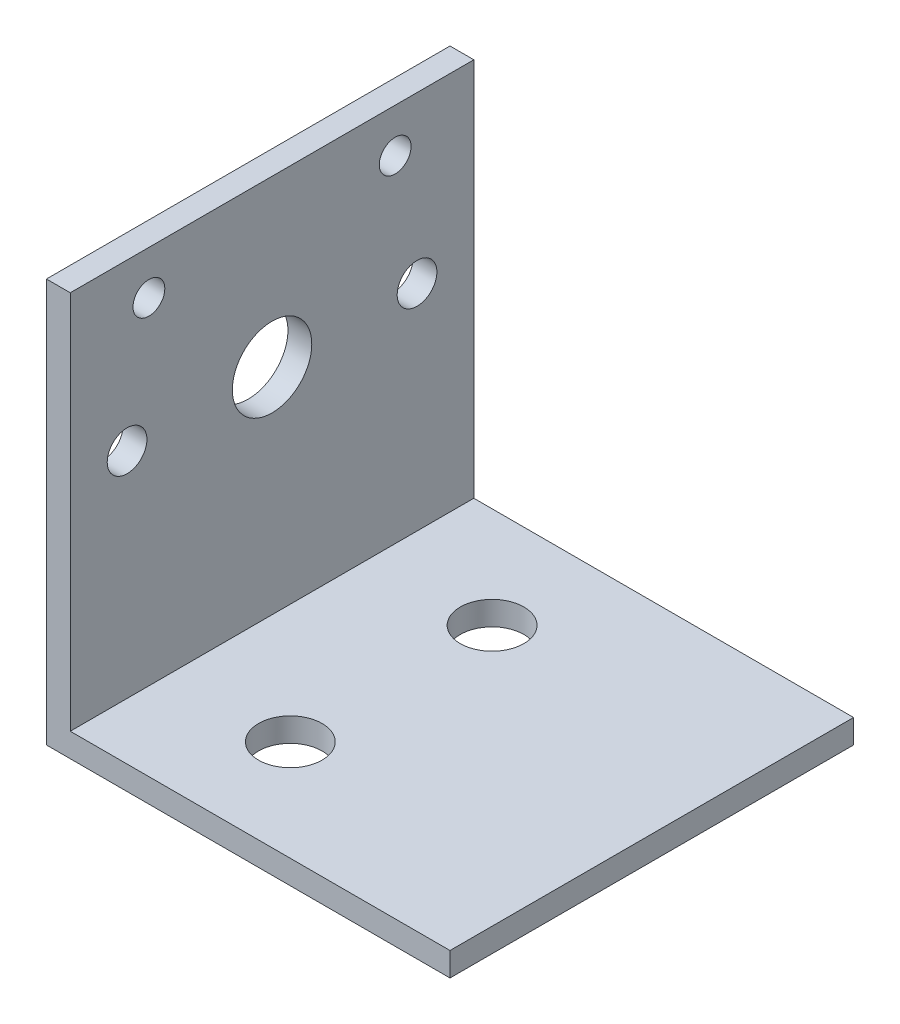
ISO-10303-21;
HEADER;
FILE_DESCRIPTION(('STEP AP214'),'2;1');
FILE_NAME('part.step','',(''),(''),'','','');
FILE_SCHEMA(('AUTOMOTIVE_DESIGN { 1 0 10303 214 1 1 1 1 }'));
ENDSEC;
DATA;
#1=APPLICATION_CONTEXT('core data for automotive mechanical design processes');
#2=APPLICATION_PROTOCOL_DEFINITION('international standard','automotive_design',2000,#1);
#3=PRODUCT_CONTEXT('',#1,'mechanical');
#4=PRODUCT('Part','Part','',(#3));
#5=PRODUCT_RELATED_PRODUCT_CATEGORY('part','',(#4));
#6=PRODUCT_DEFINITION_FORMATION('','',#4);
#7=PRODUCT_DEFINITION_CONTEXT('part definition',#1,'design');
#8=PRODUCT_DEFINITION('design','',#6,#7);
#9=PRODUCT_DEFINITION_SHAPE('','',#8);
#10=(LENGTH_UNIT() NAMED_UNIT(*) SI_UNIT(.MILLI.,.METRE.));
#11=(NAMED_UNIT(*) PLANE_ANGLE_UNIT() SI_UNIT($,.RADIAN.));
#12=(NAMED_UNIT(*) SI_UNIT($,.STERADIAN.) SOLID_ANGLE_UNIT());
#13=UNCERTAINTY_MEASURE_WITH_UNIT(LENGTH_MEASURE(1.E-05),#10,'distance_accuracy_value','');
#14=(GEOMETRIC_REPRESENTATION_CONTEXT(3) GLOBAL_UNCERTAINTY_ASSIGNED_CONTEXT((#13)) GLOBAL_UNIT_ASSIGNED_CONTEXT((#10,
#11,#12)) REPRESENTATION_CONTEXT('',''));
#15=CARTESIAN_POINT('',(0.,0.,0.));
#16=DIRECTION('',(0.,0.,1.));
#17=DIRECTION('',(1.,0.,0.));
#18=AXIS2_PLACEMENT_3D('',#15,#16,#17);
#19=CARTESIAN_POINT('',(0.,0.,25.4));
#20=DIRECTION('',(0.,1.,0.));
#21=DIRECTION('',(0.,0.,1.));
#22=AXIS2_PLACEMENT_3D('',#19,#20,#21);
#23=PLANE('',#22);
#24=CARTESIAN_POINT('',(18.,0.,-12.7));
#25=DIRECTION('',(0.,-1.,0.));
#26=DIRECTION('',(0.,0.,-1.));
#27=AXIS2_PLACEMENT_3D('',#24,#25,#26);
#28=CIRCLE('',#27,3.99999999999999);
#29=CARTESIAN_POINT('',(18.,0.,-16.7));
#30=VERTEX_POINT('',#29);
#31=EDGE_CURVE('E164',#30,#30,#28,.T.);
#32=ORIENTED_EDGE('',*,*,#31,.F.);
#33=EDGE_LOOP('',(#32));
#34=FACE_BOUND('',#33,.T.);
#35=CARTESIAN_POINT('',(18.,0.,12.7));
#36=DIRECTION('',(0.,-1.,0.));
#37=DIRECTION('',(0.,0.,-1.));
#38=AXIS2_PLACEMENT_3D('',#35,#36,#37);
#39=CIRCLE('',#38,3.99999999999999);
#40=CARTESIAN_POINT('',(18.,0.,8.70000000000001));
#41=VERTEX_POINT('',#40);
#42=EDGE_CURVE('E167',#41,#41,#39,.T.);
#43=ORIENTED_EDGE('',*,*,#42,.F.);
#44=EDGE_LOOP('',(#43));
#45=FACE_BOUND('',#44,.T.);
#46=DIRECTION('',(1.,0.,0.));
#47=VECTOR('',#46,1.);
#48=CARTESIAN_POINT('',(0.,0.,-25.4));
#49=LINE('',#48,#47);
#50=CARTESIAN_POINT('',(0.,0.,-25.4));
#51=VERTEX_POINT('',#50);
#52=CARTESIAN_POINT('',(50.8,0.,-25.4));
#53=VERTEX_POINT('',#52);
#54=EDGE_CURVE('E114',#51,#53,#49,.T.);
#55=ORIENTED_EDGE('',*,*,#54,.T.);
#56=DIRECTION('',(0.,0.,-1.));
#57=VECTOR('',#56,1.);
#58=CARTESIAN_POINT('',(50.8,0.,25.4));
#59=LINE('',#58,#57);
#60=CARTESIAN_POINT('',(50.8,0.,25.4));
#61=VERTEX_POINT('',#60);
#62=EDGE_CURVE('E11',#61,#53,#59,.T.);
#63=ORIENTED_EDGE('',*,*,#62,.F.);
#64=DIRECTION('',(1.,0.,0.));
#65=VECTOR('',#64,1.);
#66=CARTESIAN_POINT('',(0.,0.,25.4));
#67=LINE('',#66,#65);
#68=CARTESIAN_POINT('',(0.,0.,25.4));
#69=VERTEX_POINT('',#68);
#70=EDGE_CURVE('E79',#69,#61,#67,.T.);
#71=ORIENTED_EDGE('',*,*,#70,.F.);
#72=DIRECTION('',(0.,0.,-1.));
#73=VECTOR('',#72,1.);
#74=CARTESIAN_POINT('',(0.,0.,25.4));
#75=LINE('',#74,#73);
#76=EDGE_CURVE('E110',#69,#51,#75,.T.);
#77=ORIENTED_EDGE('',*,*,#76,.T.);
#78=EDGE_LOOP('',(#55,#63,#71,#77));
#79=FACE_BOUND('',#78,.T.);
#80=ADVANCED_FACE('F33',(#34,#45,#79),#23,.F.);
#81=CARTESIAN_POINT('',(50.8,3.,25.4));
#82=DIRECTION('',(1.,0.,0.));
#83=DIRECTION('',(0.,0.,-1.));
#84=AXIS2_PLACEMENT_3D('',#81,#82,#83);
#85=PLANE('',#84);
#86=DIRECTION('',(0.,-1.,0.));
#87=VECTOR('',#86,1.);
#88=CARTESIAN_POINT('',(50.8,3.,-25.4));
#89=LINE('',#88,#87);
#90=CARTESIAN_POINT('',(50.8,3.,-25.4));
#91=VERTEX_POINT('',#90);
#92=EDGE_CURVE('E117',#91,#53,#89,.T.);
#93=ORIENTED_EDGE('',*,*,#92,.F.);
#94=DIRECTION('',(0.,0.,-1.));
#95=VECTOR('',#94,1.);
#96=CARTESIAN_POINT('',(50.8,3.,25.4));
#97=LINE('',#96,#95);
#98=CARTESIAN_POINT('',(50.8,3.,25.4));
#99=VERTEX_POINT('',#98);
#100=EDGE_CURVE('E41',#99,#91,#97,.T.);
#101=ORIENTED_EDGE('',*,*,#100,.F.);
#102=DIRECTION('',(0.,-1.,0.));
#103=VECTOR('',#102,1.);
#104=CARTESIAN_POINT('',(50.8,3.,25.4));
#105=LINE('',#104,#103);
#106=EDGE_CURVE('E195',#99,#61,#105,.T.);
#107=ORIENTED_EDGE('',*,*,#106,.T.);
#108=ORIENTED_EDGE('',*,*,#62,.T.);
#109=EDGE_LOOP('',(#93,#101,#107,#108));
#110=FACE_BOUND('',#109,.T.);
#111=ADVANCED_FACE('F136',(#110),#85,.T.);
#112=CARTESIAN_POINT('',(0.,3.,25.4));
#113=DIRECTION('',(0.,1.,0.));
#114=DIRECTION('',(0.,0.,1.));
#115=AXIS2_PLACEMENT_3D('',#112,#113,#114);
#116=PLANE('',#115);
#117=CARTESIAN_POINT('',(18.,3.,-12.7));
#118=DIRECTION('',(0.,1.,0.));
#119=DIRECTION('',(0.,0.,1.));
#120=AXIS2_PLACEMENT_3D('',#117,#118,#119);
#121=CIRCLE('',#120,3.99999999999999);
#122=CARTESIAN_POINT('',(18.,3.,-8.70000000000001));
#123=VERTEX_POINT('',#122);
#124=EDGE_CURVE('E178',#123,#123,#121,.F.);
#125=ORIENTED_EDGE('',*,*,#124,.T.);
#126=EDGE_LOOP('',(#125));
#127=FACE_BOUND('',#126,.T.);
#128=CARTESIAN_POINT('',(18.,3.,12.7));
#129=DIRECTION('',(0.,1.,0.));
#130=DIRECTION('',(0.,0.,1.));
#131=AXIS2_PLACEMENT_3D('',#128,#129,#130);
#132=CIRCLE('',#131,3.99999999999999);
#133=CARTESIAN_POINT('',(18.,3.,16.7));
#134=VERTEX_POINT('',#133);
#135=EDGE_CURVE('E170',#134,#134,#132,.F.);
#136=ORIENTED_EDGE('',*,*,#135,.T.);
#137=EDGE_LOOP('',(#136));
#138=FACE_BOUND('',#137,.T.);
#139=DIRECTION('',(1.,0.,0.));
#140=VECTOR('',#139,1.);
#141=CARTESIAN_POINT('',(0.,3.,-25.4));
#142=LINE('',#141,#140);
#143=CARTESIAN_POINT('',(3.,3.,-25.4));
#144=VERTEX_POINT('',#143);
#145=EDGE_CURVE('E121',#144,#91,#142,.T.);
#146=ORIENTED_EDGE('',*,*,#145,.F.);
#147=DIRECTION('',(0.,0.,-1.));
#148=VECTOR('',#147,1.);
#149=CARTESIAN_POINT('',(3.,3.,25.4));
#150=LINE('',#149,#148);
#151=CARTESIAN_POINT('',(3.,3.,25.4));
#152=VERTEX_POINT('',#151);
#153=EDGE_CURVE('E100',#152,#144,#150,.T.);
#154=ORIENTED_EDGE('',*,*,#153,.F.);
#155=DIRECTION('',(1.,0.,0.));
#156=VECTOR('',#155,1.);
#157=CARTESIAN_POINT('',(0.,3.,25.4));
#158=LINE('',#157,#156);
#159=EDGE_CURVE('E106',#152,#99,#158,.T.);
#160=ORIENTED_EDGE('',*,*,#159,.T.);
#161=ORIENTED_EDGE('',*,*,#100,.T.);
#162=EDGE_LOOP('',(#146,#154,#160,#161));
#163=FACE_BOUND('',#162,.T.);
#164=ADVANCED_FACE('F133',(#127,#138,#163),#116,.T.);
#165=CARTESIAN_POINT('',(3.,0.,25.4));
#166=DIRECTION('',(1.,0.,0.));
#167=DIRECTION('',(0.,0.,-1.));
#168=AXIS2_PLACEMENT_3D('',#165,#166,#167);
#169=PLANE('',#168);
#170=CARTESIAN_POINT('',(3.,45.3,-15.5));
#171=DIRECTION('',(1.,0.,0.));
#172=DIRECTION('',(0.,0.,-1.));
#173=AXIS2_PLACEMENT_3D('',#170,#171,#172);
#174=CIRCLE('',#173,2.);
#175=CARTESIAN_POINT('',(3.,45.3,-17.5));
#176=VERTEX_POINT('',#175);
#177=EDGE_CURVE('E237',#176,#176,#174,.F.);
#178=ORIENTED_EDGE('',*,*,#177,.T.);
#179=EDGE_LOOP('',(#178));
#180=FACE_BOUND('',#179,.T.);
#181=CARTESIAN_POINT('',(3.,45.3,15.5));
#182=DIRECTION('',(1.,0.,0.));
#183=DIRECTION('',(0.,0.,-1.));
#184=AXIS2_PLACEMENT_3D('',#181,#182,#183);
#185=CIRCLE('',#184,2.);
#186=CARTESIAN_POINT('',(3.,45.3,13.5));
#187=VERTEX_POINT('',#186);
#188=EDGE_CURVE('E247',#187,#187,#185,.F.);
#189=ORIENTED_EDGE('',*,*,#188,.T.);
#190=EDGE_LOOP('',(#189));
#191=FACE_BOUND('',#190,.T.);
#192=CARTESIAN_POINT('',(3.,30.,18.25));
#193=DIRECTION('',(1.,0.,0.));
#194=DIRECTION('',(0.,0.,-1.));
#195=AXIS2_PLACEMENT_3D('',#192,#193,#194);
#196=CIRCLE('',#195,2.5);
#197=CARTESIAN_POINT('',(3.,30.,15.75));
#198=VERTEX_POINT('',#197);
#199=EDGE_CURVE('E185',#198,#198,#196,.F.);
#200=ORIENTED_EDGE('',*,*,#199,.T.);
#201=EDGE_LOOP('',(#200));
#202=FACE_BOUND('',#201,.T.);
#203=CARTESIAN_POINT('',(3.,30.,0.));
#204=DIRECTION('',(1.,0.,0.));
#205=DIRECTION('',(0.,0.,-1.));
#206=AXIS2_PLACEMENT_3D('',#203,#204,#205);
#207=CIRCLE('',#206,5.00000000000001);
#208=CARTESIAN_POINT('',(3.,30.,-5.00000000000001));
#209=VERTEX_POINT('',#208);
#210=EDGE_CURVE('E169',#209,#209,#207,.F.);
#211=ORIENTED_EDGE('',*,*,#210,.T.);
#212=EDGE_LOOP('',(#211));
#213=FACE_BOUND('',#212,.T.);
#214=CARTESIAN_POINT('',(3.,30.,-18.25));
#215=DIRECTION('',(1.,0.,0.));
#216=DIRECTION('',(0.,0.,-1.));
#217=AXIS2_PLACEMENT_3D('',#214,#215,#216);
#218=CIRCLE('',#217,2.5);
#219=CARTESIAN_POINT('',(3.,30.,-20.75));
#220=VERTEX_POINT('',#219);
#221=EDGE_CURVE('E184',#220,#220,#218,.F.);
#222=ORIENTED_EDGE('',*,*,#221,.T.);
#223=EDGE_LOOP('',(#222));
#224=FACE_BOUND('',#223,.T.);
#225=DIRECTION('',(0.,1.,0.));
#226=VECTOR('',#225,1.);
#227=CARTESIAN_POINT('',(3.,0.,-25.4));
#228=LINE('',#227,#226);
#229=CARTESIAN_POINT('',(3.,50.8,-25.4));
#230=VERTEX_POINT('',#229);
#231=EDGE_CURVE('E95',#230,#144,#228,.F.);
#232=ORIENTED_EDGE('',*,*,#231,.F.);
#233=DIRECTION('',(0.,0.,-1.));
#234=VECTOR('',#233,1.);
#235=CARTESIAN_POINT('',(3.,50.8,25.4));
#236=LINE('',#235,#234);
#237=CARTESIAN_POINT('',(3.,50.8,25.4));
#238=VERTEX_POINT('',#237);
#239=EDGE_CURVE('E90',#238,#230,#236,.T.);
#240=ORIENTED_EDGE('',*,*,#239,.F.);
#241=DIRECTION('',(0.,1.,0.));
#242=VECTOR('',#241,1.);
#243=CARTESIAN_POINT('',(3.,0.,25.4));
#244=LINE('',#243,#242);
#245=EDGE_CURVE('E93',#238,#152,#244,.F.);
#246=ORIENTED_EDGE('',*,*,#245,.T.);
#247=ORIENTED_EDGE('',*,*,#153,.T.);
#248=EDGE_LOOP('',(#232,#240,#246,#247));
#249=FACE_BOUND('',#248,.T.);
#250=ADVANCED_FACE('F92',(#180,#191,#202,#213,#224,#249),#169,.T.);
#251=CARTESIAN_POINT('',(0.,50.8,25.4));
#252=DIRECTION('',(0.,1.,0.));
#253=DIRECTION('',(0.,0.,1.));
#254=AXIS2_PLACEMENT_3D('',#251,#252,#253);
#255=PLANE('',#254);
#256=DIRECTION('',(1.,0.,0.));
#257=VECTOR('',#256,1.);
#258=CARTESIAN_POINT('',(0.,50.8,-25.4));
#259=LINE('',#258,#257);
#260=CARTESIAN_POINT('',(0.,50.8,-25.4));
#261=VERTEX_POINT('',#260);
#262=EDGE_CURVE('E125',#261,#230,#259,.T.);
#263=ORIENTED_EDGE('',*,*,#262,.F.);
#264=DIRECTION('',(0.,0.,-1.));
#265=VECTOR('',#264,1.);
#266=CARTESIAN_POINT('',(0.,50.8,25.4));
#267=LINE('',#266,#265);
#268=CARTESIAN_POINT('',(0.,50.8,25.4));
#269=VERTEX_POINT('',#268);
#270=EDGE_CURVE('E70',#269,#261,#267,.T.);
#271=ORIENTED_EDGE('',*,*,#270,.F.);
#272=DIRECTION('',(1.,0.,0.));
#273=VECTOR('',#272,1.);
#274=CARTESIAN_POINT('',(0.,50.8,25.4));
#275=LINE('',#274,#273);
#276=EDGE_CURVE('E104',#269,#238,#275,.T.);
#277=ORIENTED_EDGE('',*,*,#276,.T.);
#278=ORIENTED_EDGE('',*,*,#239,.T.);
#279=EDGE_LOOP('',(#263,#271,#277,#278));
#280=FACE_BOUND('',#279,.T.);
#281=ADVANCED_FACE('F108',(#280),#255,.T.);
#282=CARTESIAN_POINT('',(0.,0.,25.4));
#283=DIRECTION('',(1.,0.,0.));
#284=DIRECTION('',(0.,0.,-1.));
#285=AXIS2_PLACEMENT_3D('',#282,#283,#284);
#286=PLANE('',#285);
#287=CARTESIAN_POINT('',(0.,45.3,-15.5));
#288=DIRECTION('',(-1.,0.,0.));
#289=DIRECTION('',(0.,0.,1.));
#290=AXIS2_PLACEMENT_3D('',#287,#288,#289);
#291=CIRCLE('',#290,2.);
#292=CARTESIAN_POINT('',(0.,45.3,-13.5));
#293=VERTEX_POINT('',#292);
#294=EDGE_CURVE('E239',#293,#293,#291,.T.);
#295=ORIENTED_EDGE('',*,*,#294,.F.);
#296=EDGE_LOOP('',(#295));
#297=FACE_BOUND('',#296,.T.);
#298=CARTESIAN_POINT('',(0.,45.3,15.5));
#299=DIRECTION('',(-1.,0.,0.));
#300=DIRECTION('',(0.,0.,1.));
#301=AXIS2_PLACEMENT_3D('',#298,#299,#300);
#302=CIRCLE('',#301,2.);
#303=CARTESIAN_POINT('',(0.,45.3,17.5));
#304=VERTEX_POINT('',#303);
#305=EDGE_CURVE('E242',#304,#304,#302,.T.);
#306=ORIENTED_EDGE('',*,*,#305,.F.);
#307=EDGE_LOOP('',(#306));
#308=FACE_BOUND('',#307,.T.);
#309=CARTESIAN_POINT('',(0.,30.,18.25));
#310=DIRECTION('',(-1.,0.,0.));
#311=DIRECTION('',(0.,0.,1.));
#312=AXIS2_PLACEMENT_3D('',#309,#310,#311);
#313=CIRCLE('',#312,2.5);
#314=CARTESIAN_POINT('',(0.,30.,20.75));
#315=VERTEX_POINT('',#314);
#316=EDGE_CURVE('E181',#315,#315,#313,.T.);
#317=ORIENTED_EDGE('',*,*,#316,.F.);
#318=EDGE_LOOP('',(#317));
#319=FACE_BOUND('',#318,.T.);
#320=CARTESIAN_POINT('',(0.,30.,0.));
#321=DIRECTION('',(-1.,0.,0.));
#322=DIRECTION('',(0.,0.,1.));
#323=AXIS2_PLACEMENT_3D('',#320,#321,#322);
#324=CIRCLE('',#323,5.00000000000001);
#325=CARTESIAN_POINT('',(0.,30.,5.00000000000001));
#326=VERTEX_POINT('',#325);
#327=EDGE_CURVE('E173',#326,#326,#324,.T.);
#328=ORIENTED_EDGE('',*,*,#327,.F.);
#329=EDGE_LOOP('',(#328));
#330=FACE_BOUND('',#329,.T.);
#331=CARTESIAN_POINT('',(0.,30.,-18.25));
#332=DIRECTION('',(-1.,0.,0.));
#333=DIRECTION('',(0.,0.,1.));
#334=AXIS2_PLACEMENT_3D('',#331,#332,#333);
#335=CIRCLE('',#334,2.5);
#336=CARTESIAN_POINT('',(0.,30.,-15.75));
#337=VERTEX_POINT('',#336);
#338=EDGE_CURVE('E118',#337,#337,#335,.T.);
#339=ORIENTED_EDGE('',*,*,#338,.F.);
#340=EDGE_LOOP('',(#339));
#341=FACE_BOUND('',#340,.T.);
#342=DIRECTION('',(0.,-1.,0.));
#343=VECTOR('',#342,1.);
#344=CARTESIAN_POINT('',(0.,0.,-25.4));
#345=LINE('',#344,#343);
#346=EDGE_CURVE('E73',#261,#51,#345,.T.);
#347=ORIENTED_EDGE('',*,*,#346,.T.);
#348=ORIENTED_EDGE('',*,*,#76,.F.);
#349=DIRECTION('',(0.,-1.,0.));
#350=VECTOR('',#349,1.);
#351=CARTESIAN_POINT('',(0.,0.,25.4));
#352=LINE('',#351,#350);
#353=EDGE_CURVE('E49',#269,#69,#352,.T.);
#354=ORIENTED_EDGE('',*,*,#353,.F.);
#355=ORIENTED_EDGE('',*,*,#270,.T.);
#356=EDGE_LOOP('',(#347,#348,#354,#355));
#357=FACE_BOUND('',#356,.T.);
#358=ADVANCED_FACE('F141',(#297,#308,#319,#330,#341,#357),#286,.F.);
#359=CARTESIAN_POINT('',(0.,0.,25.4));
#360=DIRECTION('',(0.,0.,-1.));
#361=DIRECTION('',(-1.,0.,0.));
#362=AXIS2_PLACEMENT_3D('',#359,#360,#361);
#363=PLANE('',#362);
#364=ORIENTED_EDGE('',*,*,#70,.T.);
#365=ORIENTED_EDGE('',*,*,#106,.F.);
#366=ORIENTED_EDGE('',*,*,#159,.F.);
#367=ORIENTED_EDGE('',*,*,#245,.F.);
#368=ORIENTED_EDGE('',*,*,#276,.F.);
#369=ORIENTED_EDGE('',*,*,#353,.T.);
#370=EDGE_LOOP('',(#364,#365,#366,#367,#368,#369));
#371=FACE_BOUND('',#370,.T.);
#372=ADVANCED_FACE('F103',(#371),#363,.F.);
#373=CARTESIAN_POINT('',(0.,0.,-25.4));
#374=DIRECTION('',(0.,0.,-1.));
#375=DIRECTION('',(-1.,0.,0.));
#376=AXIS2_PLACEMENT_3D('',#373,#374,#375);
#377=PLANE('',#376);
#378=ORIENTED_EDGE('',*,*,#54,.F.);
#379=ORIENTED_EDGE('',*,*,#346,.F.);
#380=ORIENTED_EDGE('',*,*,#262,.T.);
#381=ORIENTED_EDGE('',*,*,#231,.T.);
#382=ORIENTED_EDGE('',*,*,#145,.T.);
#383=ORIENTED_EDGE('',*,*,#92,.T.);
#384=EDGE_LOOP('',(#378,#379,#380,#381,#382,#383));
#385=FACE_BOUND('',#384,.T.);
#386=ADVANCED_FACE('F139',(#385),#377,.T.);
#387=CARTESIAN_POINT('',(50.801,30.,-18.25));
#388=DIRECTION('',(-1.,0.,0.));
#389=DIRECTION('',(0.,0.,1.));
#390=AXIS2_PLACEMENT_3D('',#387,#388,#389);
#391=CYLINDRICAL_SURFACE('',#390,2.5);
#392=ORIENTED_EDGE('',*,*,#221,.F.);
#393=EDGE_LOOP('',(#392));
#394=FACE_BOUND('',#393,.T.);
#395=ORIENTED_EDGE('',*,*,#338,.T.);
#396=EDGE_LOOP('',(#395));
#397=FACE_BOUND('',#396,.T.);
#398=ADVANCED_FACE('F199',(#394,#397),#391,.F.);
#399=CARTESIAN_POINT('',(50.801,30.,0.));
#400=DIRECTION('',(-1.,0.,0.));
#401=DIRECTION('',(0.,0.,1.));
#402=AXIS2_PLACEMENT_3D('',#399,#400,#401);
#403=CYLINDRICAL_SURFACE('',#402,5.00000000000001);
#404=ORIENTED_EDGE('',*,*,#210,.F.);
#405=EDGE_LOOP('',(#404));
#406=FACE_BOUND('',#405,.T.);
#407=ORIENTED_EDGE('',*,*,#327,.T.);
#408=EDGE_LOOP('',(#407));
#409=FACE_BOUND('',#408,.T.);
#410=ADVANCED_FACE('F202',(#406,#409),#403,.F.);
#411=CARTESIAN_POINT('',(50.801,30.,18.25));
#412=DIRECTION('',(-1.,0.,0.));
#413=DIRECTION('',(0.,0.,1.));
#414=AXIS2_PLACEMENT_3D('',#411,#412,#413);
#415=CYLINDRICAL_SURFACE('',#414,2.5);
#416=ORIENTED_EDGE('',*,*,#199,.F.);
#417=EDGE_LOOP('',(#416));
#418=FACE_BOUND('',#417,.T.);
#419=ORIENTED_EDGE('',*,*,#316,.T.);
#420=EDGE_LOOP('',(#419));
#421=FACE_BOUND('',#420,.T.);
#422=ADVANCED_FACE('F210',(#418,#421),#415,.F.);
#423=CARTESIAN_POINT('',(18.,50.801,12.7));
#424=DIRECTION('',(0.,-1.,0.));
#425=DIRECTION('',(0.,0.,-1.));
#426=AXIS2_PLACEMENT_3D('',#423,#424,#425);
#427=CYLINDRICAL_SURFACE('',#426,3.99999999999999);
#428=ORIENTED_EDGE('',*,*,#135,.F.);
#429=EDGE_LOOP('',(#428));
#430=FACE_BOUND('',#429,.T.);
#431=ORIENTED_EDGE('',*,*,#42,.T.);
#432=EDGE_LOOP('',(#431));
#433=FACE_BOUND('',#432,.T.);
#434=ADVANCED_FACE('F216',(#430,#433),#427,.F.);
#435=CARTESIAN_POINT('',(18.,50.801,-12.7));
#436=DIRECTION('',(0.,-1.,0.));
#437=DIRECTION('',(0.,0.,-1.));
#438=AXIS2_PLACEMENT_3D('',#435,#436,#437);
#439=CYLINDRICAL_SURFACE('',#438,3.99999999999999);
#440=ORIENTED_EDGE('',*,*,#124,.F.);
#441=EDGE_LOOP('',(#440));
#442=FACE_BOUND('',#441,.T.);
#443=ORIENTED_EDGE('',*,*,#31,.T.);
#444=EDGE_LOOP('',(#443));
#445=FACE_BOUND('',#444,.T.);
#446=ADVANCED_FACE('F220',(#442,#445),#439,.F.);
#447=CARTESIAN_POINT('',(50.801,45.3,15.5));
#448=DIRECTION('',(-1.,0.,0.));
#449=DIRECTION('',(0.,0.,1.));
#450=AXIS2_PLACEMENT_3D('',#447,#448,#449);
#451=CYLINDRICAL_SURFACE('',#450,2.);
#452=ORIENTED_EDGE('',*,*,#188,.F.);
#453=EDGE_LOOP('',(#452));
#454=FACE_BOUND('',#453,.T.);
#455=ORIENTED_EDGE('',*,*,#305,.T.);
#456=EDGE_LOOP('',(#455));
#457=FACE_BOUND('',#456,.T.);
#458=ADVANCED_FACE('F224',(#454,#457),#451,.F.);
#459=CARTESIAN_POINT('',(50.801,45.3,-15.5));
#460=DIRECTION('',(-1.,0.,0.));
#461=DIRECTION('',(0.,0.,1.));
#462=AXIS2_PLACEMENT_3D('',#459,#460,#461);
#463=CYLINDRICAL_SURFACE('',#462,2.);
#464=ORIENTED_EDGE('',*,*,#177,.F.);
#465=EDGE_LOOP('',(#464));
#466=FACE_BOUND('',#465,.T.);
#467=ORIENTED_EDGE('',*,*,#294,.T.);
#468=EDGE_LOOP('',(#467));
#469=FACE_BOUND('',#468,.T.);
#470=ADVANCED_FACE('F228',(#466,#469),#463,.F.);
#471=CLOSED_SHELL('',(#80,#111,#164,#250,#281,#358,#372,#386,#398,#410,#422,#434,#446,#458,#470));
#472=MANIFOLD_SOLID_BREP('B2',#471);
#473=ADVANCED_BREP_SHAPE_REPRESENTATION('',(#18,#472),#14);
#474=SHAPE_DEFINITION_REPRESENTATION(#9,#473);
ENDSEC;
END-ISO-10303-21;
